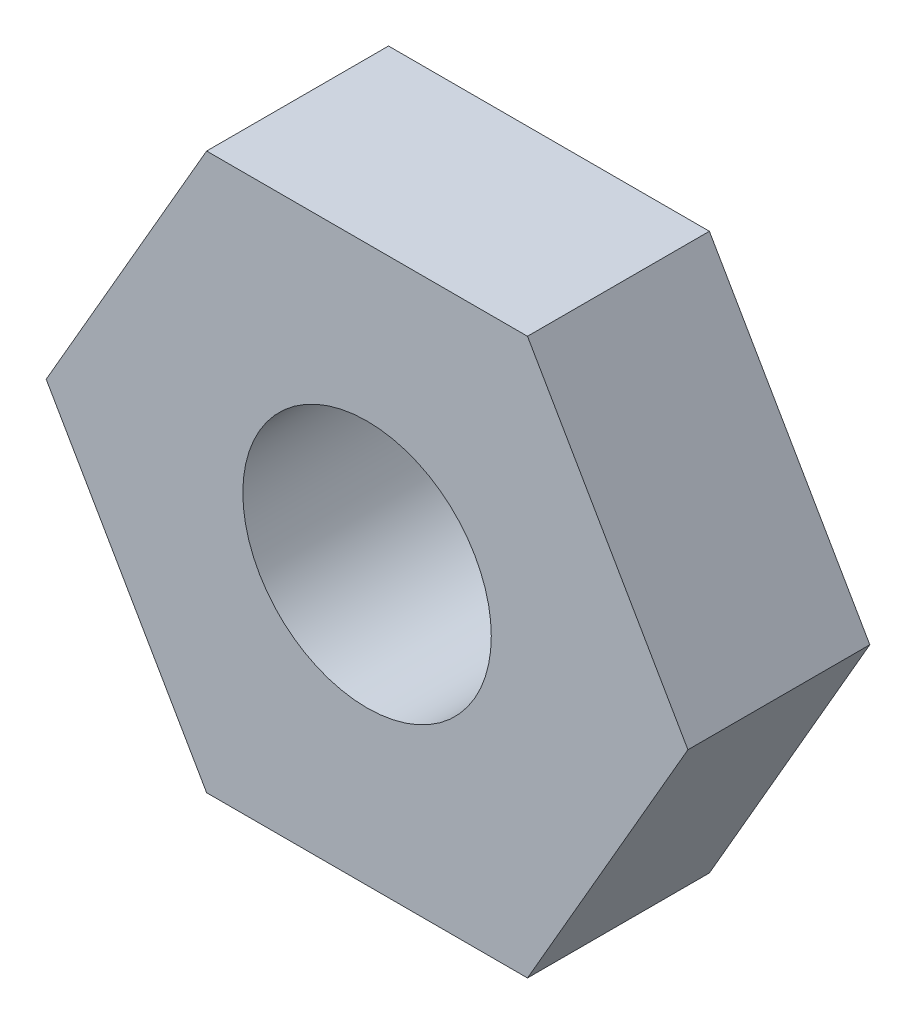
ISO-10303-21;
HEADER;
FILE_DESCRIPTION(('STEP AP214'),'2;1');
FILE_NAME('part.step','',(''),(''),'','','');
FILE_SCHEMA(('AUTOMOTIVE_DESIGN { 1 0 10303 214 1 1 1 1 }'));
ENDSEC;
DATA;
#1=APPLICATION_CONTEXT('core data for automotive mechanical design processes');
#2=APPLICATION_PROTOCOL_DEFINITION('international standard','automotive_design',2000,#1);
#3=PRODUCT_CONTEXT('',#1,'mechanical');
#4=PRODUCT('Part','Part','',(#3));
#5=PRODUCT_RELATED_PRODUCT_CATEGORY('part','',(#4));
#6=PRODUCT_DEFINITION_FORMATION('','',#4);
#7=PRODUCT_DEFINITION_CONTEXT('part definition',#1,'design');
#8=PRODUCT_DEFINITION('design','',#6,#7);
#9=PRODUCT_DEFINITION_SHAPE('','',#8);
#10=(LENGTH_UNIT() NAMED_UNIT(*) SI_UNIT(.MILLI.,.METRE.));
#11=(NAMED_UNIT(*) PLANE_ANGLE_UNIT() SI_UNIT($,.RADIAN.));
#12=(NAMED_UNIT(*) SI_UNIT($,.STERADIAN.) SOLID_ANGLE_UNIT());
#13=UNCERTAINTY_MEASURE_WITH_UNIT(LENGTH_MEASURE(1.E-05),#10,'distance_accuracy_value','');
#14=(GEOMETRIC_REPRESENTATION_CONTEXT(3) GLOBAL_UNCERTAINTY_ASSIGNED_CONTEXT((#13)) GLOBAL_UNIT_ASSIGNED_CONTEXT((#10,
#11,#12)) REPRESENTATION_CONTEXT('',''));
#15=CARTESIAN_POINT('',(0.,0.,0.));
#16=DIRECTION('',(0.,0.,1.));
#17=DIRECTION('',(1.,0.,0.));
#18=AXIS2_PLACEMENT_3D('',#15,#16,#17);
#19=CARTESIAN_POINT('',(-1.58771324027147,-2.75,-1.8));
#20=DIRECTION('',(0.,-1.,0.));
#21=DIRECTION('',(0.,0.,-1.));
#22=AXIS2_PLACEMENT_3D('',#19,#20,#21);
#23=PLANE('',#22);
#24=DIRECTION('',(1.,0.,0.));
#25=VECTOR('',#24,1.);
#26=CARTESIAN_POINT('',(-1.58771324027147,-2.75,0.));
#27=LINE('',#26,#25);
#28=CARTESIAN_POINT('',(-1.58771324027147,-2.75,0.));
#29=VERTEX_POINT('',#28);
#30=CARTESIAN_POINT('',(1.58771324027147,-2.75,0.));
#31=VERTEX_POINT('',#30);
#32=EDGE_CURVE('E124',#29,#31,#27,.T.);
#33=ORIENTED_EDGE('',*,*,#32,.F.);
#34=DIRECTION('',(0.,0.,1.));
#35=VECTOR('',#34,1.);
#36=CARTESIAN_POINT('',(-1.58771324027147,-2.75,-1.8));
#37=LINE('',#36,#35);
#38=CARTESIAN_POINT('',(-1.58771324027147,-2.75,-1.8));
#39=VERTEX_POINT('',#38);
#40=EDGE_CURVE('E11',#39,#29,#37,.T.);
#41=ORIENTED_EDGE('',*,*,#40,.F.);
#42=DIRECTION('',(1.,0.,0.));
#43=VECTOR('',#42,1.);
#44=CARTESIAN_POINT('',(-1.58771324027147,-2.75,-1.8));
#45=LINE('',#44,#43);
#46=CARTESIAN_POINT('',(1.58771324027147,-2.75,-1.8));
#47=VERTEX_POINT('',#46);
#48=EDGE_CURVE('E139',#39,#47,#45,.T.);
#49=ORIENTED_EDGE('',*,*,#48,.T.);
#50=DIRECTION('',(0.,0.,1.));
#51=VECTOR('',#50,1.);
#52=CARTESIAN_POINT('',(1.58771324027147,-2.75,-1.8));
#53=LINE('',#52,#51);
#54=EDGE_CURVE('E42',#47,#31,#53,.T.);
#55=ORIENTED_EDGE('',*,*,#54,.T.);
#56=EDGE_LOOP('',(#33,#41,#49,#55));
#57=FACE_BOUND('',#56,.T.);
#58=ADVANCED_FACE('F39',(#57),#23,.T.);
#59=CARTESIAN_POINT('',(-3.17542648054294,0.,-1.8));
#60=DIRECTION('',(-0.866025403784439,-0.5,0.));
#61=DIRECTION('',(0.5,-0.866025403784439,0.));
#62=AXIS2_PLACEMENT_3D('',#59,#60,#61);
#63=PLANE('',#62);
#64=DIRECTION('',(0.5,-0.866025403784438,0.));
#65=VECTOR('',#64,1.);
#66=CARTESIAN_POINT('',(-3.17542648054294,0.,0.));
#67=LINE('',#66,#65);
#68=CARTESIAN_POINT('',(-3.17542648054294,0.,0.));
#69=VERTEX_POINT('',#68);
#70=EDGE_CURVE('E137',#69,#29,#67,.T.);
#71=ORIENTED_EDGE('',*,*,#70,.F.);
#72=DIRECTION('',(0.,0.,1.));
#73=VECTOR('',#72,1.);
#74=CARTESIAN_POINT('',(-3.17542648054294,0.,-1.8));
#75=LINE('',#74,#73);
#76=CARTESIAN_POINT('',(-3.17542648054294,0.,-1.8));
#77=VERTEX_POINT('',#76);
#78=EDGE_CURVE('E48',#77,#69,#75,.T.);
#79=ORIENTED_EDGE('',*,*,#78,.F.);
#80=DIRECTION('',(0.5,-0.866025403784438,0.));
#81=VECTOR('',#80,1.);
#82=CARTESIAN_POINT('',(-3.17542648054294,0.,-1.8));
#83=LINE('',#82,#81);
#84=EDGE_CURVE('E114',#77,#39,#83,.T.);
#85=ORIENTED_EDGE('',*,*,#84,.T.);
#86=ORIENTED_EDGE('',*,*,#40,.T.);
#87=EDGE_LOOP('',(#71,#79,#85,#86));
#88=FACE_BOUND('',#87,.T.);
#89=ADVANCED_FACE('F147',(#88),#63,.T.);
#90=CARTESIAN_POINT('',(-1.58771324027147,2.75,-1.8));
#91=DIRECTION('',(-0.866025403784439,0.5,0.));
#92=DIRECTION('',(-0.5,-0.866025403784439,0.));
#93=AXIS2_PLACEMENT_3D('',#90,#91,#92);
#94=PLANE('',#93);
#95=DIRECTION('',(-0.5,-0.866025403784439,0.));
#96=VECTOR('',#95,1.);
#97=CARTESIAN_POINT('',(-1.58771324027147,2.75,0.));
#98=LINE('',#97,#96);
#99=CARTESIAN_POINT('',(-1.58771324027147,2.75,0.));
#100=VERTEX_POINT('',#99);
#101=EDGE_CURVE('E101',#100,#69,#98,.T.);
#102=ORIENTED_EDGE('',*,*,#101,.F.);
#103=DIRECTION('',(0.,0.,1.));
#104=VECTOR('',#103,1.);
#105=CARTESIAN_POINT('',(-1.58771324027147,2.75,-1.8));
#106=LINE('',#105,#104);
#107=CARTESIAN_POINT('',(-1.58771324027147,2.75,-1.8));
#108=VERTEX_POINT('',#107);
#109=EDGE_CURVE('E96',#108,#100,#106,.T.);
#110=ORIENTED_EDGE('',*,*,#109,.F.);
#111=DIRECTION('',(-0.5,-0.866025403784439,0.));
#112=VECTOR('',#111,1.);
#113=CARTESIAN_POINT('',(-1.58771324027147,2.75,-1.8));
#114=LINE('',#113,#112);
#115=EDGE_CURVE('E99',#108,#77,#114,.T.);
#116=ORIENTED_EDGE('',*,*,#115,.T.);
#117=ORIENTED_EDGE('',*,*,#78,.T.);
#118=EDGE_LOOP('',(#102,#110,#116,#117));
#119=FACE_BOUND('',#118,.T.);
#120=ADVANCED_FACE('F98',(#119),#94,.T.);
#121=CARTESIAN_POINT('',(1.58771324027147,2.75,-1.8));
#122=DIRECTION('',(0.,1.,0.));
#123=DIRECTION('',(-1.,0.,0.));
#124=AXIS2_PLACEMENT_3D('',#121,#122,#123);
#125=PLANE('',#124);
#126=DIRECTION('',(-1.,0.,0.));
#127=VECTOR('',#126,1.);
#128=CARTESIAN_POINT('',(1.58771324027147,2.75,0.));
#129=LINE('',#128,#127);
#130=CARTESIAN_POINT('',(1.58771324027147,2.75,0.));
#131=VERTEX_POINT('',#130);
#132=EDGE_CURVE('E134',#131,#100,#129,.T.);
#133=ORIENTED_EDGE('',*,*,#132,.F.);
#134=DIRECTION('',(0.,0.,1.));
#135=VECTOR('',#134,1.);
#136=CARTESIAN_POINT('',(1.58771324027147,2.75,-1.8));
#137=LINE('',#136,#135);
#138=CARTESIAN_POINT('',(1.58771324027147,2.75,-1.8));
#139=VERTEX_POINT('',#138);
#140=EDGE_CURVE('E106',#139,#131,#137,.T.);
#141=ORIENTED_EDGE('',*,*,#140,.F.);
#142=DIRECTION('',(-1.,0.,0.));
#143=VECTOR('',#142,1.);
#144=CARTESIAN_POINT('',(1.58771324027147,2.75,-1.8));
#145=LINE('',#144,#143);
#146=EDGE_CURVE('E112',#139,#108,#145,.T.);
#147=ORIENTED_EDGE('',*,*,#146,.T.);
#148=ORIENTED_EDGE('',*,*,#109,.T.);
#149=EDGE_LOOP('',(#133,#141,#147,#148));
#150=FACE_BOUND('',#149,.T.);
#151=ADVANCED_FACE('F116',(#150),#125,.T.);
#152=CARTESIAN_POINT('',(3.17542648054294,0.,-1.8));
#153=DIRECTION('',(0.866025403784438,0.5,0.));
#154=DIRECTION('',(-0.5,0.866025403784438,0.));
#155=AXIS2_PLACEMENT_3D('',#152,#153,#154);
#156=PLANE('',#155);
#157=DIRECTION('',(-0.5,0.866025403784438,0.));
#158=VECTOR('',#157,1.);
#159=CARTESIAN_POINT('',(3.17542648054294,0.,0.));
#160=LINE('',#159,#158);
#161=CARTESIAN_POINT('',(3.17542648054294,0.,0.));
#162=VERTEX_POINT('',#161);
#163=EDGE_CURVE('E131',#162,#131,#160,.T.);
#164=ORIENTED_EDGE('',*,*,#163,.F.);
#165=DIRECTION('',(0.,0.,1.));
#166=VECTOR('',#165,1.);
#167=CARTESIAN_POINT('',(3.17542648054294,0.,-1.8));
#168=LINE('',#167,#166);
#169=CARTESIAN_POINT('',(3.17542648054294,0.,-1.8));
#170=VERTEX_POINT('',#169);
#171=EDGE_CURVE('E142',#170,#162,#168,.T.);
#172=ORIENTED_EDGE('',*,*,#171,.F.);
#173=DIRECTION('',(-0.5,0.866025403784438,0.));
#174=VECTOR('',#173,1.);
#175=CARTESIAN_POINT('',(3.17542648054294,0.,-1.8));
#176=LINE('',#175,#174);
#177=EDGE_CURVE('E117',#170,#139,#176,.T.);
#178=ORIENTED_EDGE('',*,*,#177,.T.);
#179=ORIENTED_EDGE('',*,*,#140,.T.);
#180=EDGE_LOOP('',(#164,#172,#178,#179));
#181=FACE_BOUND('',#180,.T.);
#182=ADVANCED_FACE('F160',(#181),#156,.T.);
#183=CARTESIAN_POINT('',(1.58771324027147,-2.75,-1.8));
#184=DIRECTION('',(0.866025403784439,-0.5,0.));
#185=DIRECTION('',(0.5,0.866025403784439,0.));
#186=AXIS2_PLACEMENT_3D('',#183,#184,#185);
#187=PLANE('',#186);
#188=DIRECTION('',(0.5,0.866025403784439,0.));
#189=VECTOR('',#188,1.);
#190=CARTESIAN_POINT('',(1.58771324027147,-2.75,0.));
#191=LINE('',#190,#189);
#192=EDGE_CURVE('E127',#31,#162,#191,.T.);
#193=ORIENTED_EDGE('',*,*,#192,.F.);
#194=ORIENTED_EDGE('',*,*,#54,.F.);
#195=DIRECTION('',(0.5,0.866025403784439,0.));
#196=VECTOR('',#195,1.);
#197=CARTESIAN_POINT('',(1.58771324027147,-2.75,-1.8));
#198=LINE('',#197,#196);
#199=EDGE_CURVE('E119',#47,#170,#198,.T.);
#200=ORIENTED_EDGE('',*,*,#199,.T.);
#201=ORIENTED_EDGE('',*,*,#171,.T.);
#202=EDGE_LOOP('',(#193,#194,#200,#201));
#203=FACE_BOUND('',#202,.T.);
#204=ADVANCED_FACE('F144',(#203),#187,.T.);
#205=CARTESIAN_POINT('',(-4.76313972081441,-2.75,-1.8));
#206=DIRECTION('',(0.,0.,-1.));
#207=DIRECTION('',(-1.,0.,0.));
#208=AXIS2_PLACEMENT_3D('',#205,#206,#207);
#209=PLANE('',#208);
#210=CARTESIAN_POINT('',(0.,0.,-1.8));
#211=DIRECTION('',(0.,0.,1.));
#212=DIRECTION('',(1.,0.,0.));
#213=AXIS2_PLACEMENT_3D('',#210,#211,#212);
#214=CIRCLE('',#213,1.2295);
#215=CARTESIAN_POINT('',(1.2295,0.,-1.8));
#216=VERTEX_POINT('',#215);
#217=EDGE_CURVE('E128',#216,#216,#214,.T.);
#218=ORIENTED_EDGE('',*,*,#217,.T.);
#219=EDGE_LOOP('',(#218));
#220=FACE_BOUND('',#219,.T.);
#221=ORIENTED_EDGE('',*,*,#48,.F.);
#222=ORIENTED_EDGE('',*,*,#84,.F.);
#223=ORIENTED_EDGE('',*,*,#115,.F.);
#224=ORIENTED_EDGE('',*,*,#146,.F.);
#225=ORIENTED_EDGE('',*,*,#177,.F.);
#226=ORIENTED_EDGE('',*,*,#199,.F.);
#227=EDGE_LOOP('',(#221,#222,#223,#224,#225,#226));
#228=FACE_BOUND('',#227,.T.);
#229=ADVANCED_FACE('F110',(#220,#228),#209,.T.);
#230=CARTESIAN_POINT('',(-4.76313972081441,-2.75,0.));
#231=DIRECTION('',(0.,0.,-1.));
#232=DIRECTION('',(-1.,0.,0.));
#233=AXIS2_PLACEMENT_3D('',#230,#231,#232);
#234=PLANE('',#233);
#235=CARTESIAN_POINT('',(0.,0.,0.));
#236=DIRECTION('',(0.,0.,1.));
#237=DIRECTION('',(1.,0.,0.));
#238=AXIS2_PLACEMENT_3D('',#235,#236,#237);
#239=CIRCLE('',#238,1.2295);
#240=CARTESIAN_POINT('',(1.2295,0.,0.));
#241=VERTEX_POINT('',#240);
#242=EDGE_CURVE('E183',#241,#241,#239,.T.);
#243=ORIENTED_EDGE('',*,*,#242,.F.);
#244=EDGE_LOOP('',(#243));
#245=FACE_BOUND('',#244,.T.);
#246=ORIENTED_EDGE('',*,*,#32,.T.);
#247=ORIENTED_EDGE('',*,*,#192,.T.);
#248=ORIENTED_EDGE('',*,*,#163,.T.);
#249=ORIENTED_EDGE('',*,*,#132,.T.);
#250=ORIENTED_EDGE('',*,*,#101,.T.);
#251=ORIENTED_EDGE('',*,*,#70,.T.);
#252=EDGE_LOOP('',(#246,#247,#248,#249,#250,#251));
#253=FACE_BOUND('',#252,.T.);
#254=ADVANCED_FACE('F146',(#245,#253),#234,.F.);
#255=CARTESIAN_POINT('',(0.,0.,-1.8));
#256=DIRECTION('',(0.,0.,1.));
#257=DIRECTION('',(1.,0.,0.));
#258=AXIS2_PLACEMENT_3D('',#255,#256,#257);
#259=CYLINDRICAL_SURFACE('',#258,1.2295);
#260=ORIENTED_EDGE('',*,*,#217,.F.);
#261=EDGE_LOOP('',(#260));
#262=FACE_BOUND('',#261,.T.);
#263=ORIENTED_EDGE('',*,*,#242,.T.);
#264=EDGE_LOOP('',(#263));
#265=FACE_BOUND('',#264,.T.);
#266=ADVANCED_FACE('F171',(#262,#265),#259,.F.);
#267=CLOSED_SHELL('',(#58,#89,#120,#151,#182,#204,#229,#254,#266));
#268=MANIFOLD_SOLID_BREP('B2',#267);
#269=ADVANCED_BREP_SHAPE_REPRESENTATION('',(#18,#268),#14);
#270=SHAPE_DEFINITION_REPRESENTATION(#9,#269);
ENDSEC;
END-ISO-10303-21;
